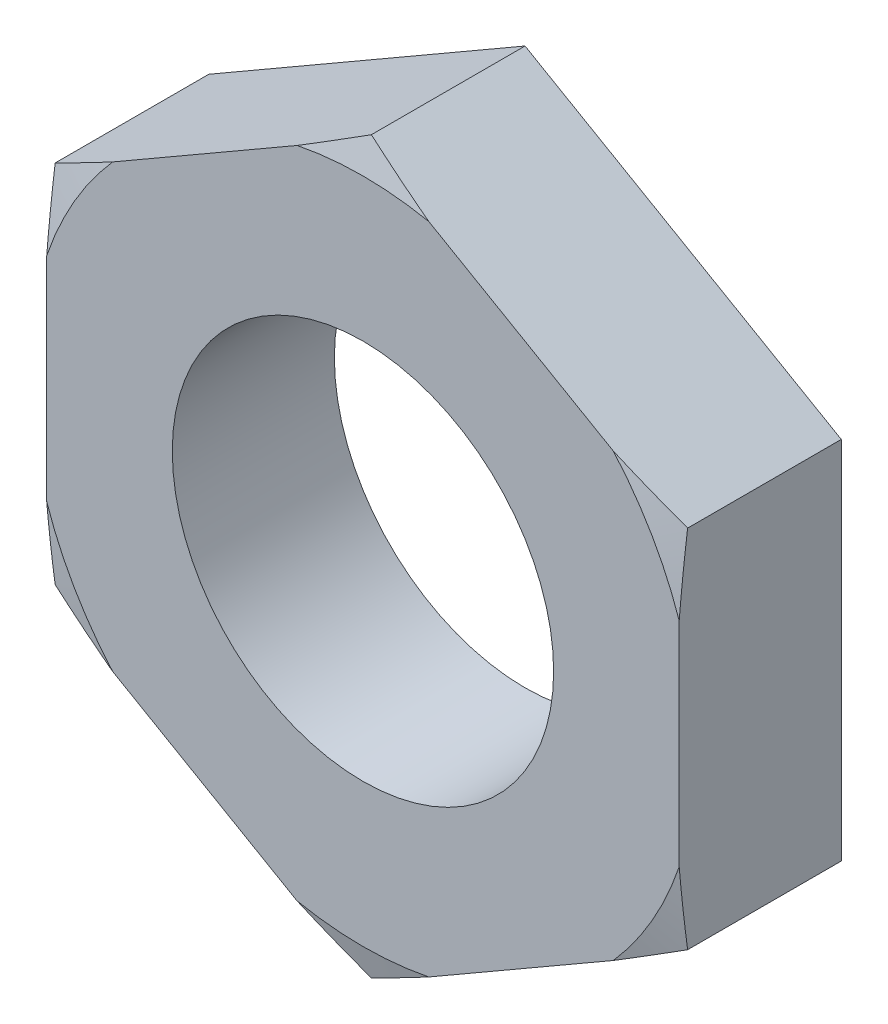
ISO-10303-21;
HEADER;
FILE_DESCRIPTION(('STEP AP214'),'2;1');
FILE_NAME('part.step','',(''),(''),'','','');
FILE_SCHEMA(('AUTOMOTIVE_DESIGN { 1 0 10303 214 1 1 1 1 }'));
ENDSEC;
DATA;
#1=APPLICATION_CONTEXT('core data for automotive mechanical design processes');
#2=APPLICATION_PROTOCOL_DEFINITION('international standard','automotive_design',2000,#1);
#3=PRODUCT_CONTEXT('',#1,'mechanical');
#4=PRODUCT('Part','Part','',(#3));
#5=PRODUCT_RELATED_PRODUCT_CATEGORY('part','',(#4));
#6=PRODUCT_DEFINITION_FORMATION('','',#4);
#7=PRODUCT_DEFINITION_CONTEXT('part definition',#1,'design');
#8=PRODUCT_DEFINITION('design','',#6,#7);
#9=PRODUCT_DEFINITION_SHAPE('','',#8);
#10=(LENGTH_UNIT() NAMED_UNIT(*) SI_UNIT(.MILLI.,.METRE.));
#11=(NAMED_UNIT(*) PLANE_ANGLE_UNIT() SI_UNIT($,.RADIAN.));
#12=(NAMED_UNIT(*) SI_UNIT($,.STERADIAN.) SOLID_ANGLE_UNIT());
#13=UNCERTAINTY_MEASURE_WITH_UNIT(LENGTH_MEASURE(1.E-05),#10,'distance_accuracy_value','');
#14=(GEOMETRIC_REPRESENTATION_CONTEXT(3) GLOBAL_UNCERTAINTY_ASSIGNED_CONTEXT((#13)) GLOBAL_UNIT_ASSIGNED_CONTEXT((#10,
#11,#12)) REPRESENTATION_CONTEXT('',''));
#15=CARTESIAN_POINT('',(0.,0.,0.));
#16=DIRECTION('',(0.,0.,1.));
#17=DIRECTION('',(1.,0.,0.));
#18=AXIS2_PLACEMENT_3D('',#15,#16,#17);
#19=CARTESIAN_POINT('',(0.,3.83,1.7));
#20=DIRECTION('',(0.,0.,1.));
#21=DIRECTION('',(1.,0.,0.));
#22=AXIS2_PLACEMENT_3D('',#19,#20,#21);
#23=PLANE('',#22);
#24=CARTESIAN_POINT('',(0.,0.,1.7));
#25=DIRECTION('',(0.,0.,1.));
#26=DIRECTION('',(1.,0.,0.));
#27=AXIS2_PLACEMENT_3D('',#24,#25,#26);
#28=CIRCLE('',#27,2.);
#29=CARTESIAN_POINT('',(2.,0.,1.7));
#30=VERTEX_POINT('',#29);
#31=EDGE_CURVE('E183',#30,#30,#28,.T.);
#32=ORIENTED_EDGE('',*,*,#31,.F.);
#33=EDGE_LOOP('',(#32));
#34=FACE_BOUND('',#33,.T.);
#35=DIRECTION('',(0.,1.,0.));
#36=VECTOR('',#35,1.);
#37=CARTESIAN_POINT('',(3.3168772964944,-1.915,1.7));
#38=LINE('',#37,#36);
#39=CARTESIAN_POINT('',(3.3168772964944,-1.11728465486644,1.7));
#40=VERTEX_POINT('',#39);
#41=CARTESIAN_POINT('',(3.3168772964944,1.11728465486644,1.7));
#42=VERTEX_POINT('',#41);
#43=EDGE_CURVE('E151',#40,#42,#38,.T.);
#44=ORIENTED_EDGE('',*,*,#43,.T.);
#45=CARTESIAN_POINT('',(0.,0.,1.7));
#46=DIRECTION('',(0.,0.,1.));
#47=DIRECTION('',(1.,0.,0.));
#48=AXIS2_PLACEMENT_3D('',#45,#46,#47);
#49=CIRCLE('',#48,3.5);
#50=CARTESIAN_POINT('',(2.62603554262006,2.31385767256678,1.7));
#51=VERTEX_POINT('',#50);
#52=EDGE_CURVE('E137',#42,#51,#49,.T.);
#53=ORIENTED_EDGE('',*,*,#52,.T.);
#54=DIRECTION('',(-0.866025403784439,0.5,0.));
#55=VECTOR('',#54,1.);
#56=CARTESIAN_POINT('',(3.3168772964944,1.915,1.7));
#57=LINE('',#56,#55);
#58=CARTESIAN_POINT('',(0.690841753874339,3.43114232743322,1.7));
#59=VERTEX_POINT('',#58);
#60=EDGE_CURVE('E148',#51,#59,#57,.T.);
#61=ORIENTED_EDGE('',*,*,#60,.T.);
#62=CARTESIAN_POINT('',(-0.690841753874347,3.43114232743322,1.7));
#63=VERTEX_POINT('',#62);
#64=EDGE_CURVE('E152',#59,#63,#49,.T.);
#65=ORIENTED_EDGE('',*,*,#64,.T.);
#66=DIRECTION('',(-0.866025403784439,-0.5,0.));
#67=VECTOR('',#66,1.);
#68=CARTESIAN_POINT('',(0.,3.83,1.7));
#69=LINE('',#68,#67);
#70=CARTESIAN_POINT('',(-2.62603554262006,2.31385767256679,1.7));
#71=VERTEX_POINT('',#70);
#72=EDGE_CURVE('E156',#63,#71,#69,.T.);
#73=ORIENTED_EDGE('',*,*,#72,.T.);
#74=CARTESIAN_POINT('',(-3.3168772964944,1.11728465486643,1.7));
#75=VERTEX_POINT('',#74);
#76=EDGE_CURVE('E242',#71,#75,#49,.T.);
#77=ORIENTED_EDGE('',*,*,#76,.T.);
#78=DIRECTION('',(0.,-1.,0.));
#79=VECTOR('',#78,1.);
#80=CARTESIAN_POINT('',(-3.3168772964944,1.915,1.7));
#81=LINE('',#80,#79);
#82=CARTESIAN_POINT('',(-3.3168772964944,-1.11728465486643,1.7));
#83=VERTEX_POINT('',#82);
#84=EDGE_CURVE('E160',#75,#83,#81,.T.);
#85=ORIENTED_EDGE('',*,*,#84,.T.);
#86=CARTESIAN_POINT('',(-2.62603554262006,-2.31385767256679,1.7));
#87=VERTEX_POINT('',#86);
#88=EDGE_CURVE('E243',#83,#87,#49,.T.);
#89=ORIENTED_EDGE('',*,*,#88,.T.);
#90=DIRECTION('',(0.866025403784439,-0.5,0.));
#91=VECTOR('',#90,1.);
#92=CARTESIAN_POINT('',(-3.3168772964944,-1.915,1.7));
#93=LINE('',#92,#91);
#94=CARTESIAN_POINT('',(-0.690841753874343,-3.43114232743322,1.7));
#95=VERTEX_POINT('',#94);
#96=EDGE_CURVE('E171',#87,#95,#93,.T.);
#97=ORIENTED_EDGE('',*,*,#96,.T.);
#98=CARTESIAN_POINT('',(0.690841753874338,-3.43114232743322,1.7));
#99=VERTEX_POINT('',#98);
#100=EDGE_CURVE('E406',#95,#99,#49,.T.);
#101=ORIENTED_EDGE('',*,*,#100,.T.);
#102=DIRECTION('',(0.866025403784439,0.5,0.));
#103=VECTOR('',#102,1.);
#104=CARTESIAN_POINT('',(0.,-3.83,1.7));
#105=LINE('',#104,#103);
#106=CARTESIAN_POINT('',(2.62603554262006,-2.31385767256678,1.7));
#107=VERTEX_POINT('',#106);
#108=EDGE_CURVE('E174',#99,#107,#105,.T.);
#109=ORIENTED_EDGE('',*,*,#108,.T.);
#110=EDGE_CURVE('E154',#107,#40,#49,.T.);
#111=ORIENTED_EDGE('',*,*,#110,.T.);
#112=EDGE_LOOP('',(#44,#53,#61,#65,#73,#77,#85,#89,#97,#101,#109,#111));
#113=FACE_BOUND('',#112,.T.);
#114=ADVANCED_FACE('F40',(#34,#113),#23,.T.);
#115=CARTESIAN_POINT('',(3.3168772964944,1.915,1.7));
#116=DIRECTION('',(-0.5,-0.866025403784439,0.));
#117=DIRECTION('',(0.866025403784439,-0.5,0.));
#118=AXIS2_PLACEMENT_3D('',#115,#116,#117);
#119=PLANE('',#118);
#120=CARTESIAN_POINT('',(5.83127776582853,0.463310212179416,1.07041199792404));
#121=CARTESIAN_POINT('',(5.72454057004419,0.524934960898053,1.09761167825971));
#122=CARTESIAN_POINT('',(5.61774329277782,0.586594397676514,1.12449721546284));
#123=CARTESIAN_POINT('',(5.4040056099263,0.709995906406806,1.17751349561719));
#124=CARTESIAN_POINT('',(5.29706520078815,0.771737980409962,1.20364421945372));
#125=CARTESIAN_POINT('',(4.97591681139783,0.957153089474277,1.28073302611032));
#126=CARTESIAN_POINT('',(4.76146753073402,1.08096543939305,1.33036565078184));
#127=CARTESIAN_POINT('',(4.33045714599396,1.32980940104625,1.42491878920381));
#128=CARTESIAN_POINT('',(4.11389107107299,1.45484388269921,1.4698094791682));
#129=CARTESIAN_POINT('',(3.67971957745825,1.70551291141215,1.55238021606378));
#130=CARTESIAN_POINT('',(3.46211419427549,1.83114743796982,1.59006050757825));
#131=CARTESIAN_POINT('',(3.03064158356245,2.08025826591295,1.65455481637842));
#132=CARTESIAN_POINT('',(2.81680078209559,2.20371931020356,1.68159481106668));
#133=CARTESIAN_POINT('',(2.49536833235979,2.38929842158481,1.71264945493049));
#134=CARTESIAN_POINT('',(2.38811767692694,2.45121961636972,1.72141657780274));
#135=CARTESIAN_POINT('',(2.17344775491806,2.57515935362847,1.73547903403678));
#136=CARTESIAN_POINT('',(2.06602849696467,2.63717789112401,1.74077453949432));
#137=CARTESIAN_POINT('',(1.85141126641249,2.76108720695604,1.74767480148922));
#138=CARTESIAN_POINT('',(1.7442135526138,2.82297783587423,1.74929019048154));
#139=CARTESIAN_POINT('',(1.52982412045231,2.94675563224408,1.74879555234484));
#140=CARTESIAN_POINT('',(1.42263240211828,3.00864279967912,1.74668550865365));
#141=CARTESIAN_POINT('',(1.20834183677083,3.13236351526727,1.73882591831331));
#142=CARTESIAN_POINT('',(1.10124299777306,3.19419705879253,1.73307608383068));
#143=CARTESIAN_POINT('',(0.887223122887742,3.3177614911695,1.71815886682356));
#144=CARTESIAN_POINT('',(0.780302092834531,3.37949237665275,1.70899137429633));
#145=CARTESIAN_POINT('',(0.540230967095622,3.51809750572277,1.68489942858229));
#146=CARTESIAN_POINT('',(0.407146114960128,3.59493408092826,1.66911135901775));
#147=CARTESIAN_POINT('',(0.141411769621497,3.74835587674245,1.63342195673454));
#148=CARTESIAN_POINT('',(0.00876223214955031,3.82494112290975,1.61352105631884));
#149=CARTESIAN_POINT('',(-0.256338287389561,3.97799697922797,1.57028019175486));
#150=CARTESIAN_POINT('',(-0.388788565033383,4.05446718267987,1.54693452469754));
#151=CARTESIAN_POINT('',(-0.65330013437474,4.20718300844287,1.4974665893571));
#152=CARTESIAN_POINT('',(-0.785361415394538,4.28342862458918,1.47134424557242));
#153=CARTESIAN_POINT('',(-1.05113855194364,4.43687512592025,1.41644690357126));
#154=CARTESIAN_POINT('',(-1.18484906766289,4.51407292816425,1.38763763772524));
#155=CARTESIAN_POINT('',(-1.45195973971002,4.66828934657408,1.32816566356498));
#156=CARTESIAN_POINT('',(-1.58535989478451,4.74530796201628,1.29750294777909));
#157=CARTESIAN_POINT('',(-1.85149667072547,4.89896210124705,1.23478224796359));
#158=CARTESIAN_POINT('',(-1.98423408225671,4.97559808152614,1.20272871801099));
#159=CARTESIAN_POINT('',(-2.24947851844549,5.12873702816078,1.13741133476902));
#160=CARTESIAN_POINT('',(-2.38198555466086,5.20524000118925,1.10414754414812));
#161=CARTESIAN_POINT('',(-2.51440046933414,5.28168978782058,1.07041199792404));
#162=B_SPLINE_CURVE_WITH_KNOTS('',3,(#120,#121,#122,#123,#124,#125,#126,#127,#128,#129,#130,
#131,#132,#133,#134,#135,#136,#137,#138,#139,#140,#141,#142,#143,#144,#145,#146,#147,#148,#149,
#150,#151,#152,#153,#154,#155,#156,#157,#158,#159,#160,#161),.UNSPECIFIED.,.F.,.F.,(4,2,2,2,2,2,
2,2,2,2,2,2,2,2,2,2,2,2,2,2,4),(0.,0.378644677792938,0.75729893588407,1.51491215740246,
2.27703740739011,3.03913680080998,3.7840422528208,4.15645781003339,4.52885490438812,
4.90017471104937,5.27149616849226,5.64284699358403,6.01420977222405,6.4775870497984,
6.94091564616266,7.40502008598296,7.86913714865619,8.3403044432172,8.8114736372795,
9.28123161893634,9.75096531059096),.UNSPECIFIED.);
#163=CARTESIAN_POINT('',(3.3168772964944,1.91500000000002,1.61157676649776));
#164=VERTEX_POINT('',#163);
#165=EDGE_CURVE('E134',#164,#51,#162,.T.);
#166=ORIENTED_EDGE('',*,*,#165,.F.);
#167=DIRECTION('',(0.,0.,-1.));
#168=VECTOR('',#167,1.);
#169=CARTESIAN_POINT('',(3.3168772964944,1.915,1.7));
#170=LINE('',#169,#168);
#171=CARTESIAN_POINT('',(3.3168772964944,1.915,0.));
#172=VERTEX_POINT('',#171);
#173=EDGE_CURVE('E178',#164,#172,#170,.T.);
#174=ORIENTED_EDGE('',*,*,#173,.T.);
#175=DIRECTION('',(-0.866025403784439,0.5,0.));
#176=VECTOR('',#175,1.);
#177=CARTESIAN_POINT('',(3.3168772964944,1.915,0.));
#178=LINE('',#177,#176);
#179=CARTESIAN_POINT('',(0.,3.83,0.));
#180=VERTEX_POINT('',#179);
#181=EDGE_CURVE('E179',#172,#180,#178,.T.);
#182=ORIENTED_EDGE('',*,*,#181,.T.);
#183=DIRECTION('',(0.,0.,-1.));
#184=VECTOR('',#183,1.);
#185=CARTESIAN_POINT('',(0.,3.83,1.7));
#186=LINE('',#185,#184);
#187=CARTESIAN_POINT('',(0.,3.83,1.61157676649773));
#188=VERTEX_POINT('',#187);
#189=EDGE_CURVE('E202',#188,#180,#186,.T.);
#190=ORIENTED_EDGE('',*,*,#189,.F.);
#191=EDGE_CURVE('E62',#59,#188,#162,.T.);
#192=ORIENTED_EDGE('',*,*,#191,.F.);
#193=ORIENTED_EDGE('',*,*,#60,.F.);
#194=EDGE_LOOP('',(#166,#174,#182,#190,#192,#193));
#195=FACE_BOUND('',#194,.T.);
#196=ADVANCED_FACE('F42',(#195),#119,.F.);
#197=CARTESIAN_POINT('',(0.,3.83,1.7));
#198=DIRECTION('',(0.5,-0.866025403784439,0.));
#199=DIRECTION('',(0.866025403784439,0.5,0.));
#200=AXIS2_PLACEMENT_3D('',#197,#198,#199);
#201=PLANE('',#200);
#202=CARTESIAN_POINT('',(2.51440046933414,5.28168978782059,1.07041199792404));
#203=CARTESIAN_POINT('',(2.40766327354979,5.22006503910195,1.09761167825971));
#204=CARTESIAN_POINT('',(2.30086599628342,5.15840560232349,1.12449721546284));
#205=CARTESIAN_POINT('',(2.0871283134319,5.0350040935932,1.17751349561718));
#206=CARTESIAN_POINT('',(1.98018790429375,4.97326201959004,1.20364421945372));
#207=CARTESIAN_POINT('',(1.65903951490343,4.78784691052573,1.28073302611032));
#208=CARTESIAN_POINT('',(1.44459023423962,4.66403456060695,1.33036565078184));
#209=CARTESIAN_POINT('',(1.01357984949956,4.41519059895375,1.42491878920381));
#210=CARTESIAN_POINT('',(0.797013774578592,4.29015611730079,1.4698094791682));
#211=CARTESIAN_POINT('',(0.362842280963847,4.03948708858786,1.55238021606378));
#212=CARTESIAN_POINT('',(0.145236897781087,3.91385256203018,1.59006050757825));
#213=CARTESIAN_POINT('',(-0.28623571293195,3.66474173408705,1.65455481637842));
#214=CARTESIAN_POINT('',(-0.500076514398812,3.54128068979644,1.68159481106668));
#215=CARTESIAN_POINT('',(-0.82150896413461,3.35570157841519,1.71264945493049));
#216=CARTESIAN_POINT('',(-0.928759619567454,3.29378038363028,1.72141657780274));
#217=CARTESIAN_POINT('',(-1.14342954157634,3.16984064637153,1.73547903403678));
#218=CARTESIAN_POINT('',(-1.25084879952973,3.10782210887599,1.74077453949432));
#219=CARTESIAN_POINT('',(-1.46546603008191,2.98391279304396,1.74767480148922));
#220=CARTESIAN_POINT('',(-1.5726637438806,2.92202216412577,1.74929019048154));
#221=CARTESIAN_POINT('',(-1.78705317604209,2.79824436775592,1.74879555234484));
#222=CARTESIAN_POINT('',(-1.89424489437612,2.73635720032088,1.74668550865365));
#223=CARTESIAN_POINT('',(-2.10853545972357,2.61263648473273,1.73882591831331));
#224=CARTESIAN_POINT('',(-2.21563429872134,2.55080294120747,1.73307608383068));
#225=CARTESIAN_POINT('',(-2.42965417360666,2.4272385088305,1.71815886682356));
#226=CARTESIAN_POINT('',(-2.53657520365987,2.36550762334725,1.70899137429633));
#227=CARTESIAN_POINT('',(-2.77664632939878,2.22690249427723,1.68489942858229));
#228=CARTESIAN_POINT('',(-2.90973118153427,2.15006591907174,1.66911135901775));
#229=CARTESIAN_POINT('',(-3.1754655268729,1.99664412325755,1.63342195673454));
#230=CARTESIAN_POINT('',(-3.30811506434485,1.92005887709025,1.61352105631884));
#231=CARTESIAN_POINT('',(-3.57321558388396,1.76700302077203,1.57028019175486));
#232=CARTESIAN_POINT('',(-3.70566586152778,1.69053281732013,1.54693452469754));
#233=CARTESIAN_POINT('',(-3.97017743086914,1.53781699155713,1.4974665893571));
#234=CARTESIAN_POINT('',(-4.10223871188894,1.46157137541082,1.47134424557242));
#235=CARTESIAN_POINT('',(-4.36801584843804,1.30812487407975,1.41644690357126));
#236=CARTESIAN_POINT('',(-4.50172636415729,1.23092707183575,1.38763763772524));
#237=CARTESIAN_POINT('',(-4.76883703620442,1.07671065342592,1.32816566356498));
#238=CARTESIAN_POINT('',(-4.90223719127891,0.999692037983725,1.29750294777909));
#239=CARTESIAN_POINT('',(-5.16837396721987,0.846037898752953,1.23478224796359));
#240=CARTESIAN_POINT('',(-5.30111137875111,0.769401918473859,1.20272871801099));
#241=CARTESIAN_POINT('',(-5.56635581493989,0.616262971839215,1.13741133476902));
#242=CARTESIAN_POINT('',(-5.69886285115526,0.539759998810751,1.10414754414812));
#243=CARTESIAN_POINT('',(-5.83127776582854,0.463310212179415,1.07041199792404));
#244=B_SPLINE_CURVE_WITH_KNOTS('',3,(#202,#203,#204,#205,#206,#207,#208,#209,#210,#211,#212,
#213,#214,#215,#216,#217,#218,#219,#220,#221,#222,#223,#224,#225,#226,#227,#228,#229,#230,#231,
#232,#233,#234,#235,#236,#237,#238,#239,#240,#241,#242,#243),.UNSPECIFIED.,.F.,.F.,(4,2,2,2,2,2,
2,2,2,2,2,2,2,2,2,2,2,2,2,2,4),(0.,0.378644677792938,0.75729893588407,1.51491215740246,
2.27703740739011,3.03913680080998,3.7840422528208,4.15645781003339,4.52885490438812,
4.90017471104937,5.27149616849226,5.64284699358403,6.01420977222405,6.4775870497984,
6.94091564616267,7.40502008598296,7.86913714865619,8.34030444321721,8.8114736372795,
9.28123161893634,9.75096531059097),.UNSPECIFIED.);
#245=EDGE_CURVE('E209',#188,#63,#244,.T.);
#246=ORIENTED_EDGE('',*,*,#245,.F.);
#247=ORIENTED_EDGE('',*,*,#189,.T.);
#248=DIRECTION('',(-0.866025403784439,-0.5,0.));
#249=VECTOR('',#248,1.);
#250=CARTESIAN_POINT('',(0.,3.83,0.));
#251=LINE('',#250,#249);
#252=CARTESIAN_POINT('',(-3.3168772964944,1.915,0.));
#253=VERTEX_POINT('',#252);
#254=EDGE_CURVE('E182',#180,#253,#251,.T.);
#255=ORIENTED_EDGE('',*,*,#254,.T.);
#256=DIRECTION('',(0.,0.,-1.));
#257=VECTOR('',#256,1.);
#258=CARTESIAN_POINT('',(-3.3168772964944,1.915,1.7));
#259=LINE('',#258,#257);
#260=CARTESIAN_POINT('',(-3.3168772964944,1.915,1.61157676649773));
#261=VERTEX_POINT('',#260);
#262=EDGE_CURVE('E201',#261,#253,#259,.T.);
#263=ORIENTED_EDGE('',*,*,#262,.F.);
#264=EDGE_CURVE('E70',#71,#261,#244,.T.);
#265=ORIENTED_EDGE('',*,*,#264,.F.);
#266=ORIENTED_EDGE('',*,*,#72,.F.);
#267=EDGE_LOOP('',(#246,#247,#255,#263,#265,#266));
#268=FACE_BOUND('',#267,.T.);
#269=ADVANCED_FACE('F205',(#268),#201,.F.);
#270=CARTESIAN_POINT('',(-3.3168772964944,1.915,1.7));
#271=DIRECTION('',(1.,0.,0.));
#272=DIRECTION('',(0.,1.,0.));
#273=AXIS2_PLACEMENT_3D('',#270,#271,#272);
#274=PLANE('',#273);
#275=CARTESIAN_POINT('',(-3.3168772964944,4.42940046933414,1.15508558009258));
#276=CARTESIAN_POINT('',(-3.3168772964944,4.31261414766034,1.18013106176752));
#277=CARTESIAN_POINT('',(-3.3168772964944,4.19575609414231,1.20484207574603));
#278=CARTESIAN_POINT('',(-3.3168772964944,3.96187035183646,1.25346502622969));
#279=CARTESIAN_POINT('',(-3.3168772964944,3.84484265805379,1.27737693868625));
#280=CARTESIAN_POINT('',(-3.3168772964944,3.49336210948602,1.34773944299208));
#281=CARTESIAN_POINT('',(-3.3168772964944,3.25862570622043,1.39279210586532));
#282=CARTESIAN_POINT('',(-3.3168772964944,2.78712363481906,1.47790136933605));
#283=CARTESIAN_POINT('',(-3.3168772964944,2.55035359810239,1.51793407619066));
#284=CARTESIAN_POINT('',(-3.3168772964944,2.07568839182853,1.59068263671723));
#285=CARTESIAN_POINT('',(-3.3168772964944,1.83779332464369,1.62339914352676));
#286=CARTESIAN_POINT('',(-3.3168772964944,1.36574060266296,1.67832505469384));
#287=CARTESIAN_POINT('',(-3.3168772964944,1.13160733292008,1.700737658205));
#288=CARTESIAN_POINT('',(-3.3168772964944,0.662501437500895,1.73353757029341));
#289=CARTESIAN_POINT('',(-3.3168772964944,0.427528956548072,1.74392686053913));
#290=CARTESIAN_POINT('',(-3.3168772964944,-0.0420777814691951,1.75121028460556));
#291=CARTESIAN_POINT('',(-3.3168772964944,-0.276711523467778,1.74813628872953));
#292=CARTESIAN_POINT('',(-3.3168772964944,-0.745453993516248,1.72902153534255));
#293=CARTESIAN_POINT('',(-3.3168772964944,-0.979562666522371,1.71297947674267));
#294=CARTESIAN_POINT('',(-3.3168772964944,-1.34761483984397,1.67911471645908));
#295=CARTESIAN_POINT('',(-3.3168772964944,-1.48191356070077,1.66493531422273));
#296=CARTESIAN_POINT('',(-3.3168772964944,-1.7501290314242,1.63345459980087));
#297=CARTESIAN_POINT('',(-3.3168772964944,-1.88404582144436,1.61615362908475));
#298=CARTESIAN_POINT('',(-3.3168772964944,-2.28554916041534,1.56025112300066));
#299=CARTESIAN_POINT('',(-3.3168772964944,-2.55258301147016,1.51768031915314));
#300=CARTESIAN_POINT('',(-3.3168772964944,-2.95386825731731,1.44803878843683));
#301=CARTESIAN_POINT('',(-3.3168772964944,-3.08861098994295,1.42368712649009));
#302=CARTESIAN_POINT('',(-3.3168772964944,-3.35780677365734,1.3734199199636));
#303=CARTESIAN_POINT('',(-3.3168772964944,-3.49225982411678,1.34750437199003));
#304=CARTESIAN_POINT('',(-3.3168772964944,-3.76062289275526,1.294443281552));
#305=CARTESIAN_POINT('',(-3.3168772964944,-3.89453345743434,1.26730048354005));
#306=CARTESIAN_POINT('',(-3.3168772964944,-4.16212746482975,1.21194406949389));
#307=CARTESIAN_POINT('',(-3.3168772964944,-4.29581091690068,1.18373049873888));
#308=CARTESIAN_POINT('',(-3.3168772964944,-4.42940046933414,1.15508558009258));
#309=B_SPLINE_CURVE_WITH_KNOTS('',3,(#275,#276,#277,#278,#279,#280,#281,#282,#283,#284,#285,
#286,#287,#288,#289,#290,#291,#292,#293,#294,#295,#296,#297,#298,#299,#300,#301,#302,#303,#304,
#305,#306,#307,#308),.UNSPECIFIED.,.F.,.F.,(4,2,2,2,2,2,2,2,2,2,2,2,2,2,2,2,4),(0.,
0.358324147617178,0.716659069135222,1.43367857395301,2.1539908740305,2.87423884412771,
3.57959964764408,4.2848441778508,4.98842015604283,5.69206673294867,6.09716918992448,
6.50222735945047,7.31326445750313,7.7240375117298,8.13481145741815,8.54470831329544,
8.95458785534944),.UNSPECIFIED.);
#310=EDGE_CURVE('E239',#261,#75,#309,.T.);
#311=ORIENTED_EDGE('',*,*,#310,.F.);
#312=ORIENTED_EDGE('',*,*,#262,.T.);
#313=DIRECTION('',(0.,-1.,0.));
#314=VECTOR('',#313,1.);
#315=CARTESIAN_POINT('',(-3.3168772964944,1.915,0.));
#316=LINE('',#315,#314);
#317=CARTESIAN_POINT('',(-3.3168772964944,-1.915,0.));
#318=VERTEX_POINT('',#317);
#319=EDGE_CURVE('E186',#253,#318,#316,.T.);
#320=ORIENTED_EDGE('',*,*,#319,.T.);
#321=DIRECTION('',(0.,0.,-1.));
#322=VECTOR('',#321,1.);
#323=CARTESIAN_POINT('',(-3.3168772964944,-1.915,1.7));
#324=LINE('',#323,#322);
#325=CARTESIAN_POINT('',(-3.3168772964944,-1.915,1.61157676649773));
#326=VERTEX_POINT('',#325);
#327=EDGE_CURVE('E199',#326,#318,#324,.T.);
#328=ORIENTED_EDGE('',*,*,#327,.F.);
#329=EDGE_CURVE('E278',#83,#326,#309,.T.);
#330=ORIENTED_EDGE('',*,*,#329,.F.);
#331=ORIENTED_EDGE('',*,*,#84,.F.);
#332=EDGE_LOOP('',(#311,#312,#320,#328,#330,#331));
#333=FACE_BOUND('',#332,.T.);
#334=ADVANCED_FACE('F237',(#333),#274,.F.);
#335=CARTESIAN_POINT('',(-3.3168772964944,-1.915,1.7));
#336=DIRECTION('',(0.5,0.866025403784439,0.));
#337=DIRECTION('',(-0.866025403784439,0.5,0.));
#338=AXIS2_PLACEMENT_3D('',#335,#336,#337);
#339=PLANE('',#338);
#340=CARTESIAN_POINT('',(-5.83127776582854,-0.463310212179414,1.07041199792404));
#341=CARTESIAN_POINT('',(-5.72454057004419,-0.524934960898051,1.09761167825971));
#342=CARTESIAN_POINT('',(-5.61774329277782,-0.586594397676512,1.12449721546284));
#343=CARTESIAN_POINT('',(-5.4040056099263,-0.709995906406804,1.17751349561718));
#344=CARTESIAN_POINT('',(-5.29706520078815,-0.77173798040996,1.20364421945372));
#345=CARTESIAN_POINT('',(-4.97591681139783,-0.957153089474275,1.28073302611032));
#346=CARTESIAN_POINT('',(-4.76146753073402,-1.08096543939305,1.33036565078184));
#347=CARTESIAN_POINT('',(-4.33045714599396,-1.32980940104625,1.42491878920381));
#348=CARTESIAN_POINT('',(-4.11389107107299,-1.45484388269921,1.4698094791682));
#349=CARTESIAN_POINT('',(-3.67971957745825,-1.70551291141214,1.55238021606378));
#350=CARTESIAN_POINT('',(-3.46211419427549,-1.83114743796982,1.59006050757825));
#351=CARTESIAN_POINT('',(-3.03064158356245,-2.08025826591295,1.65455481637842));
#352=CARTESIAN_POINT('',(-2.81680078209559,-2.20371931020356,1.68159481106668));
#353=CARTESIAN_POINT('',(-2.49536833235979,-2.38929842158481,1.71264945493049));
#354=CARTESIAN_POINT('',(-2.38811767692695,-2.45121961636972,1.72141657780274));
#355=CARTESIAN_POINT('',(-2.17344775491806,-2.57515935362847,1.73547903403678));
#356=CARTESIAN_POINT('',(-2.06602849696467,-2.63717789112401,1.74077453949432));
#357=CARTESIAN_POINT('',(-1.85141126641249,-2.76108720695604,1.74767480148922));
#358=CARTESIAN_POINT('',(-1.7442135526138,-2.82297783587423,1.74929019048154));
#359=CARTESIAN_POINT('',(-1.52982412045231,-2.94675563224408,1.74879555234484));
#360=CARTESIAN_POINT('',(-1.42263240211828,-3.00864279967912,1.74668550865365));
#361=CARTESIAN_POINT('',(-1.20834183677083,-3.13236351526727,1.73882591831331));
#362=CARTESIAN_POINT('',(-1.10124299777306,-3.19419705879253,1.73307608383068));
#363=CARTESIAN_POINT('',(-0.887223122887742,-3.3177614911695,1.71815886682356));
#364=CARTESIAN_POINT('',(-0.780302092834531,-3.37949237665275,1.70899137429633));
#365=CARTESIAN_POINT('',(-0.540230967095622,-3.51809750572277,1.68489942858229));
#366=CARTESIAN_POINT('',(-0.407146114960128,-3.59493408092826,1.66911135901775));
#367=CARTESIAN_POINT('',(-0.141411769621497,-3.74835587674245,1.63342195673454));
#368=CARTESIAN_POINT('',(-0.00876223214955061,-3.82494112290975,1.61352105631884));
#369=CARTESIAN_POINT('',(0.25633828738956,-3.97799697922797,1.57028019175486));
#370=CARTESIAN_POINT('',(0.388788565033383,-4.05446718267987,1.54693452469754));
#371=CARTESIAN_POINT('',(0.653300134374739,-4.20718300844287,1.4974665893571));
#372=CARTESIAN_POINT('',(0.785361415394537,-4.28342862458918,1.47134424557242));
#373=CARTESIAN_POINT('',(1.05113855194364,-4.43687512592025,1.41644690357126));
#374=CARTESIAN_POINT('',(1.18484906766289,-4.51407292816425,1.38763763772524));
#375=CARTESIAN_POINT('',(1.45195973971002,-4.66828934657408,1.32816566356498));
#376=CARTESIAN_POINT('',(1.58535989478451,-4.74530796201628,1.29750294777909));
#377=CARTESIAN_POINT('',(1.85149667072547,-4.89896210124705,1.23478224796359));
#378=CARTESIAN_POINT('',(1.98423408225671,-4.97559808152614,1.20272871801099));
#379=CARTESIAN_POINT('',(2.24947851844549,-5.12873702816078,1.13741133476902));
#380=CARTESIAN_POINT('',(2.38198555466086,-5.20524000118925,1.10414754414812));
#381=CARTESIAN_POINT('',(2.51440046933414,-5.28168978782058,1.07041199792404));
#382=B_SPLINE_CURVE_WITH_KNOTS('',3,(#340,#341,#342,#343,#344,#345,#346,#347,#348,#349,#350,
#351,#352,#353,#354,#355,#356,#357,#358,#359,#360,#361,#362,#363,#364,#365,#366,#367,#368,#369,
#370,#371,#372,#373,#374,#375,#376,#377,#378,#379,#380,#381),.UNSPECIFIED.,.F.,.F.,(4,2,2,2,2,2,
2,2,2,2,2,2,2,2,2,2,2,2,2,2,4),(0.,0.378644677792938,0.75729893588407,1.51491215740246,
2.27703740739011,3.03913680080998,3.7840422528208,4.15645781003339,4.52885490438812,
4.90017471104937,5.27149616849226,5.64284699358403,6.01420977222405,6.4775870497984,
6.94091564616267,7.40502008598296,7.86913714865619,8.34030444321721,8.8114736372795,
9.28123161893634,9.75096531059097),.UNSPECIFIED.);
#383=EDGE_CURVE('E234',#326,#87,#382,.T.);
#384=ORIENTED_EDGE('',*,*,#383,.F.);
#385=ORIENTED_EDGE('',*,*,#327,.T.);
#386=DIRECTION('',(0.866025403784439,-0.5,0.));
#387=VECTOR('',#386,1.);
#388=CARTESIAN_POINT('',(-3.3168772964944,-1.915,0.));
#389=LINE('',#388,#387);
#390=CARTESIAN_POINT('',(0.,-3.83,0.));
#391=VERTEX_POINT('',#390);
#392=EDGE_CURVE('E189',#318,#391,#389,.T.);
#393=ORIENTED_EDGE('',*,*,#392,.T.);
#394=DIRECTION('',(0.,0.,-1.));
#395=VECTOR('',#394,1.);
#396=CARTESIAN_POINT('',(0.,-3.83,1.7));
#397=LINE('',#396,#395);
#398=CARTESIAN_POINT('',(0.,-3.83,1.61157676649773));
#399=VERTEX_POINT('',#398);
#400=EDGE_CURVE('E197',#399,#391,#397,.T.);
#401=ORIENTED_EDGE('',*,*,#400,.F.);
#402=EDGE_CURVE('E272',#95,#399,#382,.T.);
#403=ORIENTED_EDGE('',*,*,#402,.F.);
#404=ORIENTED_EDGE('',*,*,#96,.F.);
#405=EDGE_LOOP('',(#384,#385,#393,#401,#403,#404));
#406=FACE_BOUND('',#405,.T.);
#407=ADVANCED_FACE('F231',(#406),#339,.F.);
#408=CARTESIAN_POINT('',(0.,-3.83,1.7));
#409=DIRECTION('',(-0.5,0.866025403784439,0.));
#410=DIRECTION('',(-0.866025403784439,-0.5,0.));
#411=AXIS2_PLACEMENT_3D('',#408,#409,#410);
#412=PLANE('',#411);
#413=CARTESIAN_POINT('',(-2.51440046933414,-5.28168978782058,1.07041199792404));
#414=CARTESIAN_POINT('',(-2.40766327354979,-5.22006503910195,1.09761167825971));
#415=CARTESIAN_POINT('',(-2.30086599628342,-5.15840560232349,1.12449721546284));
#416=CARTESIAN_POINT('',(-2.0871283134319,-5.0350040935932,1.17751349561718));
#417=CARTESIAN_POINT('',(-1.98018790429375,-4.97326201959004,1.20364421945372));
#418=CARTESIAN_POINT('',(-1.65903951490344,-4.78784691052572,1.28073302611032));
#419=CARTESIAN_POINT('',(-1.44459023423962,-4.66403456060695,1.33036565078184));
#420=CARTESIAN_POINT('',(-1.01357984949956,-4.41519059895375,1.42491878920381));
#421=CARTESIAN_POINT('',(-0.797013774578594,-4.29015611730079,1.4698094791682));
#422=CARTESIAN_POINT('',(-0.36284228096385,-4.03948708858786,1.55238021606378));
#423=CARTESIAN_POINT('',(-0.145236897781089,-3.91385256203018,1.59006050757825));
#424=CARTESIAN_POINT('',(0.286235712931948,-3.66474173408705,1.65455481637842));
#425=CARTESIAN_POINT('',(0.50007651439881,-3.54128068979644,1.68159481106668));
#426=CARTESIAN_POINT('',(0.821508964134609,-3.35570157841519,1.71264945493049));
#427=CARTESIAN_POINT('',(0.928759619567452,-3.29378038363028,1.72141657780274));
#428=CARTESIAN_POINT('',(1.14342954157634,-3.16984064637153,1.73547903403678));
#429=CARTESIAN_POINT('',(1.25084879952973,-3.10782210887599,1.74077453949432));
#430=CARTESIAN_POINT('',(1.46546603008191,-2.98391279304396,1.74767480148922));
#431=CARTESIAN_POINT('',(1.5726637438806,-2.92202216412577,1.74929019048154));
#432=CARTESIAN_POINT('',(1.78705317604209,-2.79824436775592,1.74879555234484));
#433=CARTESIAN_POINT('',(1.89424489437611,-2.73635720032087,1.74668550865365));
#434=CARTESIAN_POINT('',(2.10853545972356,-2.61263648473273,1.73882591831331));
#435=CARTESIAN_POINT('',(2.21563429872133,-2.55080294120747,1.73307608383068));
#436=CARTESIAN_POINT('',(2.42965417360666,-2.4272385088305,1.71815886682357));
#437=CARTESIAN_POINT('',(2.53657520365987,-2.36550762334724,1.70899137429633));
#438=CARTESIAN_POINT('',(2.77664632939878,-2.22690249427723,1.68489942858229));
#439=CARTESIAN_POINT('',(2.90973118153427,-2.15006591907174,1.66911135901775));
#440=CARTESIAN_POINT('',(3.1754655268729,-1.99664412325755,1.63342195673454));
#441=CARTESIAN_POINT('',(3.30811506434485,-1.92005887709025,1.61352105631884));
#442=CARTESIAN_POINT('',(3.57321558388396,-1.76700302077203,1.57028019175486));
#443=CARTESIAN_POINT('',(3.70566586152778,-1.69053281732013,1.54693452469754));
#444=CARTESIAN_POINT('',(3.97017743086914,-1.53781699155713,1.4974665893571));
#445=CARTESIAN_POINT('',(4.10223871188893,-1.46157137541082,1.47134424557242));
#446=CARTESIAN_POINT('',(4.36801584843804,-1.30812487407975,1.41644690357126));
#447=CARTESIAN_POINT('',(4.50172636415729,-1.23092707183575,1.38763763772524));
#448=CARTESIAN_POINT('',(4.76883703620442,-1.07671065342592,1.32816566356498));
#449=CARTESIAN_POINT('',(4.90223719127891,-0.999692037983725,1.29750294777909));
#450=CARTESIAN_POINT('',(5.16837396721987,-0.846037898752953,1.23478224796359));
#451=CARTESIAN_POINT('',(5.30111137875111,-0.769401918473859,1.20272871801099));
#452=CARTESIAN_POINT('',(5.56635581493989,-0.616262971839216,1.13741133476902));
#453=CARTESIAN_POINT('',(5.69886285115526,-0.539759998810752,1.10414754414812));
#454=CARTESIAN_POINT('',(5.83127776582853,-0.463310212179415,1.07041199792404));
#455=B_SPLINE_CURVE_WITH_KNOTS('',3,(#413,#414,#415,#416,#417,#418,#419,#420,#421,#422,#423,
#424,#425,#426,#427,#428,#429,#430,#431,#432,#433,#434,#435,#436,#437,#438,#439,#440,#441,#442,
#443,#444,#445,#446,#447,#448,#449,#450,#451,#452,#453,#454),.UNSPECIFIED.,.F.,.F.,(4,2,2,2,2,2,
2,2,2,2,2,2,2,2,2,2,2,2,2,2,4),(0.,0.378644677792938,0.75729893588407,1.51491215740246,
2.27703740739011,3.03913680080998,3.7840422528208,4.15645781003339,4.52885490438812,
4.90017471104937,5.27149616849226,5.64284699358403,6.01420977222405,6.4775870497984,
6.94091564616267,7.40502008598296,7.86913714865619,8.34030444321721,8.8114736372795,
9.28123161893634,9.75096531059096),.UNSPECIFIED.);
#456=EDGE_CURVE('E227',#399,#99,#455,.T.);
#457=ORIENTED_EDGE('',*,*,#456,.F.);
#458=ORIENTED_EDGE('',*,*,#400,.T.);
#459=DIRECTION('',(0.866025403784439,0.5,0.));
#460=VECTOR('',#459,1.);
#461=CARTESIAN_POINT('',(0.,-3.83,0.));
#462=LINE('',#461,#460);
#463=CARTESIAN_POINT('',(3.3168772964944,-1.915,0.));
#464=VERTEX_POINT('',#463);
#465=EDGE_CURVE('E163',#391,#464,#462,.T.);
#466=ORIENTED_EDGE('',*,*,#465,.T.);
#467=DIRECTION('',(0.,0.,-1.));
#468=VECTOR('',#467,1.);
#469=CARTESIAN_POINT('',(3.3168772964944,-1.915,1.7));
#470=LINE('',#469,#468);
#471=CARTESIAN_POINT('',(3.3168772964944,-1.915,1.61157676649773));
#472=VERTEX_POINT('',#471);
#473=EDGE_CURVE('E195',#472,#464,#470,.T.);
#474=ORIENTED_EDGE('',*,*,#473,.F.);
#475=EDGE_CURVE('E142',#107,#472,#455,.T.);
#476=ORIENTED_EDGE('',*,*,#475,.F.);
#477=ORIENTED_EDGE('',*,*,#108,.F.);
#478=EDGE_LOOP('',(#457,#458,#466,#474,#476,#477));
#479=FACE_BOUND('',#478,.T.);
#480=ADVANCED_FACE('F223',(#479),#412,.F.);
#481=CARTESIAN_POINT('',(3.3168772964944,-1.915,1.7));
#482=DIRECTION('',(-1.,0.,0.));
#483=DIRECTION('',(0.,-1.,0.));
#484=AXIS2_PLACEMENT_3D('',#481,#482,#483);
#485=PLANE('',#484);
#486=CARTESIAN_POINT('',(3.3168772964944,-4.42940046933414,1.15508558009258));
#487=CARTESIAN_POINT('',(3.3168772964944,-4.31261414766034,1.18013106176752));
#488=CARTESIAN_POINT('',(3.3168772964944,-4.1957560941423,1.20484207574603));
#489=CARTESIAN_POINT('',(3.3168772964944,-3.96187035183646,1.25346502622969));
#490=CARTESIAN_POINT('',(3.3168772964944,-3.84484265805379,1.27737693868625));
#491=CARTESIAN_POINT('',(3.3168772964944,-3.49336210948602,1.34773944299208));
#492=CARTESIAN_POINT('',(3.3168772964944,-3.25862570622043,1.39279210586532));
#493=CARTESIAN_POINT('',(3.3168772964944,-2.78712363481906,1.47790136933605));
#494=CARTESIAN_POINT('',(3.3168772964944,-2.55035359810239,1.51793407619066));
#495=CARTESIAN_POINT('',(3.3168772964944,-2.07568839182853,1.59068263671723));
#496=CARTESIAN_POINT('',(3.3168772964944,-1.83779332464369,1.62339914352676));
#497=CARTESIAN_POINT('',(3.3168772964944,-1.36574060266296,1.67832505469384));
#498=CARTESIAN_POINT('',(3.3168772964944,-1.13160733292008,1.700737658205));
#499=CARTESIAN_POINT('',(3.3168772964944,-0.662501437500896,1.73353757029341));
#500=CARTESIAN_POINT('',(3.3168772964944,-0.427528956548073,1.74392686053913));
#501=CARTESIAN_POINT('',(3.3168772964944,0.0420777814691944,1.75121028460556));
#502=CARTESIAN_POINT('',(3.3168772964944,0.276711523467777,1.74813628872953));
#503=CARTESIAN_POINT('',(3.3168772964944,0.745453993516247,1.72902153534255));
#504=CARTESIAN_POINT('',(3.3168772964944,0.97956266652237,1.71297947674267));
#505=CARTESIAN_POINT('',(3.3168772964944,1.34761483984397,1.67911471645909));
#506=CARTESIAN_POINT('',(3.3168772964944,1.48191356070076,1.66493531422273));
#507=CARTESIAN_POINT('',(3.3168772964944,1.7501290314242,1.63345459980087));
#508=CARTESIAN_POINT('',(3.3168772964944,1.88404582144436,1.61615362908475));
#509=CARTESIAN_POINT('',(3.3168772964944,2.28554916041534,1.56025112300066));
#510=CARTESIAN_POINT('',(3.3168772964944,2.55258301147016,1.51768031915314));
#511=CARTESIAN_POINT('',(3.3168772964944,2.95386825731731,1.44803878843683));
#512=CARTESIAN_POINT('',(3.3168772964944,3.08861098994295,1.42368712649009));
#513=CARTESIAN_POINT('',(3.3168772964944,3.35780677365734,1.3734199199636));
#514=CARTESIAN_POINT('',(3.3168772964944,3.49225982411678,1.34750437199003));
#515=CARTESIAN_POINT('',(3.3168772964944,3.76062289275526,1.294443281552));
#516=CARTESIAN_POINT('',(3.3168772964944,3.89453345743434,1.26730048354005));
#517=CARTESIAN_POINT('',(3.3168772964944,4.16212746482976,1.21194406949389));
#518=CARTESIAN_POINT('',(3.3168772964944,4.29581091690068,1.18373049873888));
#519=CARTESIAN_POINT('',(3.3168772964944,4.42940046933414,1.15508558009258));
#520=B_SPLINE_CURVE_WITH_KNOTS('',3,(#486,#487,#488,#489,#490,#491,#492,#493,#494,#495,#496,
#497,#498,#499,#500,#501,#502,#503,#504,#505,#506,#507,#508,#509,#510,#511,#512,#513,#514,#515,
#516,#517,#518,#519),.UNSPECIFIED.,.F.,.F.,(4,2,2,2,2,2,2,2,2,2,2,2,2,2,2,2,4),(0.,
0.358324147617179,0.716659069135223,1.43367857395301,2.1539908740305,2.8742388441277,
3.57959964764408,4.2848441778508,4.98842015604283,5.69206673294867,6.09716918992448,
6.50222735945047,7.31326445750313,7.7240375117298,8.13481145741815,8.54470831329544,
8.95458785534944),.UNSPECIFIED.);
#521=EDGE_CURVE('E12',#472,#40,#520,.T.);
#522=ORIENTED_EDGE('',*,*,#521,.F.);
#523=ORIENTED_EDGE('',*,*,#473,.T.);
#524=DIRECTION('',(0.,1.,0.));
#525=VECTOR('',#524,1.);
#526=CARTESIAN_POINT('',(3.3168772964944,-1.915,0.));
#527=LINE('',#526,#525);
#528=EDGE_CURVE('E157',#464,#172,#527,.T.);
#529=ORIENTED_EDGE('',*,*,#528,.T.);
#530=ORIENTED_EDGE('',*,*,#173,.F.);
#531=EDGE_CURVE('E45',#42,#164,#520,.T.);
#532=ORIENTED_EDGE('',*,*,#531,.F.);
#533=ORIENTED_EDGE('',*,*,#43,.F.);
#534=EDGE_LOOP('',(#522,#523,#529,#530,#532,#533));
#535=FACE_BOUND('',#534,.T.);
#536=ADVANCED_FACE('F218',(#535),#485,.F.);
#537=CARTESIAN_POINT('',(0.,3.83,0.));
#538=DIRECTION('',(0.,0.,1.));
#539=DIRECTION('',(1.,0.,0.));
#540=AXIS2_PLACEMENT_3D('',#537,#538,#539);
#541=PLANE('',#540);
#542=ORIENTED_EDGE('',*,*,#181,.F.);
#543=ORIENTED_EDGE('',*,*,#528,.F.);
#544=ORIENTED_EDGE('',*,*,#465,.F.);
#545=ORIENTED_EDGE('',*,*,#392,.F.);
#546=ORIENTED_EDGE('',*,*,#319,.F.);
#547=ORIENTED_EDGE('',*,*,#254,.F.);
#548=EDGE_LOOP('',(#542,#543,#544,#545,#546,#547));
#549=FACE_BOUND('',#548,.T.);
#550=CARTESIAN_POINT('',(0.,0.,0.));
#551=DIRECTION('',(0.,0.,1.));
#552=DIRECTION('',(1.,0.,0.));
#553=AXIS2_PLACEMENT_3D('',#550,#551,#552);
#554=CIRCLE('',#553,2.);
#555=CARTESIAN_POINT('',(2.,0.,0.));
#556=VERTEX_POINT('',#555);
#557=EDGE_CURVE('E166',#556,#556,#554,.T.);
#558=ORIENTED_EDGE('',*,*,#557,.T.);
#559=EDGE_LOOP('',(#558));
#560=FACE_BOUND('',#559,.T.);
#561=ADVANCED_FACE('F212',(#549,#560),#541,.F.);
#562=CARTESIAN_POINT('',(0.,0.,1.7));
#563=DIRECTION('',(0.,0.,-1.));
#564=DIRECTION('',(-1.,0.,0.));
#565=AXIS2_PLACEMENT_3D('',#562,#563,#564);
#566=CYLINDRICAL_SURFACE('',#565,2.);
#567=ORIENTED_EDGE('',*,*,#31,.T.);
#568=EDGE_LOOP('',(#567));
#569=FACE_BOUND('',#568,.T.);
#570=ORIENTED_EDGE('',*,*,#557,.F.);
#571=EDGE_LOOP('',(#570));
#572=FACE_BOUND('',#571,.T.);
#573=ADVANCED_FACE('F260',(#569,#572),#566,.F.);
#574=CARTESIAN_POINT('',(0.,0.,1.7));
#575=DIRECTION('',(0.,0.,-1.));
#576=DIRECTION('',(1.,0.,0.));
#577=AXIS2_PLACEMENT_3D('',#574,#575,#576);
#578=CONICAL_SURFACE('',#577,3.5,1.30899693899575);
#579=ORIENTED_EDGE('',*,*,#165,.T.);
#580=ORIENTED_EDGE('',*,*,#52,.F.);
#581=ORIENTED_EDGE('',*,*,#531,.T.);
#582=EDGE_LOOP('',(#579,#580,#581));
#583=FACE_BOUND('',#582,.T.);
#584=ADVANCED_FACE('F136',(#583),#578,.T.);
#585=ORIENTED_EDGE('',*,*,#475,.T.);
#586=ORIENTED_EDGE('',*,*,#521,.T.);
#587=ORIENTED_EDGE('',*,*,#110,.F.);
#588=EDGE_LOOP('',(#585,#586,#587));
#589=FACE_BOUND('',#588,.T.);
#590=ADVANCED_FACE('F362',(#589),#578,.T.);
#591=ORIENTED_EDGE('',*,*,#402,.T.);
#592=ORIENTED_EDGE('',*,*,#456,.T.);
#593=ORIENTED_EDGE('',*,*,#100,.F.);
#594=EDGE_LOOP('',(#591,#592,#593));
#595=FACE_BOUND('',#594,.T.);
#596=ADVANCED_FACE('F367',(#595),#578,.T.);
#597=ORIENTED_EDGE('',*,*,#329,.T.);
#598=ORIENTED_EDGE('',*,*,#383,.T.);
#599=ORIENTED_EDGE('',*,*,#88,.F.);
#600=EDGE_LOOP('',(#597,#598,#599));
#601=FACE_BOUND('',#600,.T.);
#602=ADVANCED_FACE('F374',(#601),#578,.T.);
#603=ORIENTED_EDGE('',*,*,#264,.T.);
#604=ORIENTED_EDGE('',*,*,#310,.T.);
#605=ORIENTED_EDGE('',*,*,#76,.F.);
#606=EDGE_LOOP('',(#603,#604,#605));
#607=FACE_BOUND('',#606,.T.);
#608=ADVANCED_FACE('F259',(#607),#578,.T.);
#609=ORIENTED_EDGE('',*,*,#191,.T.);
#610=ORIENTED_EDGE('',*,*,#245,.T.);
#611=ORIENTED_EDGE('',*,*,#64,.F.);
#612=EDGE_LOOP('',(#609,#610,#611));
#613=FACE_BOUND('',#612,.T.);
#614=ADVANCED_FACE('F255',(#613),#578,.T.);
#615=CLOSED_SHELL('',(#114,#196,#269,#334,#407,#480,#536,#561,#573,#584,#590,#596,#602,#608,#614));
#616=MANIFOLD_SOLID_BREP('B2',#615);
#617=ADVANCED_BREP_SHAPE_REPRESENTATION('',(#18,#616),#14);
#618=SHAPE_DEFINITION_REPRESENTATION(#9,#617);
ENDSEC;
END-ISO-10303-21;
